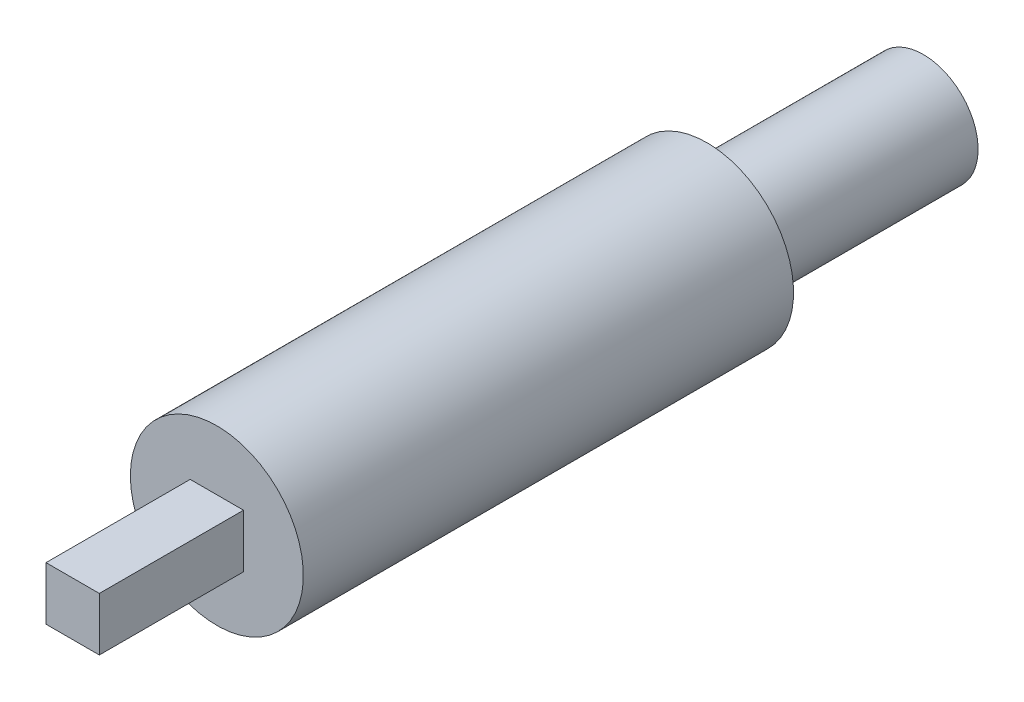
ISO-10303-21;
HEADER;
FILE_DESCRIPTION(('STEP AP214'),'2;1');
FILE_NAME('part.step','',(''),(''),'','','');
FILE_SCHEMA(('AUTOMOTIVE_DESIGN { 1 0 10303 214 1 1 1 1 }'));
ENDSEC;
DATA;
#1=APPLICATION_CONTEXT('core data for automotive mechanical design processes');
#2=APPLICATION_PROTOCOL_DEFINITION('international standard','automotive_design',2000,#1);
#3=PRODUCT_CONTEXT('',#1,'mechanical');
#4=PRODUCT('Part','Part','',(#3));
#5=PRODUCT_RELATED_PRODUCT_CATEGORY('part','',(#4));
#6=PRODUCT_DEFINITION_FORMATION('','',#4);
#7=PRODUCT_DEFINITION_CONTEXT('part definition',#1,'design');
#8=PRODUCT_DEFINITION('design','',#6,#7);
#9=PRODUCT_DEFINITION_SHAPE('','',#8);
#10=(LENGTH_UNIT() NAMED_UNIT(*) SI_UNIT(.MILLI.,.METRE.));
#11=(NAMED_UNIT(*) PLANE_ANGLE_UNIT() SI_UNIT($,.RADIAN.));
#12=(NAMED_UNIT(*) SI_UNIT($,.STERADIAN.) SOLID_ANGLE_UNIT());
#13=UNCERTAINTY_MEASURE_WITH_UNIT(LENGTH_MEASURE(1.E-05),#10,'distance_accuracy_value','');
#14=(GEOMETRIC_REPRESENTATION_CONTEXT(3) GLOBAL_UNCERTAINTY_ASSIGNED_CONTEXT((#13)) GLOBAL_UNIT_ASSIGNED_CONTEXT((#10,
#11,#12)) REPRESENTATION_CONTEXT('',''));
#15=CARTESIAN_POINT('',(0.,0.,0.));
#16=DIRECTION('',(0.,0.,1.));
#17=DIRECTION('',(1.,0.,0.));
#18=AXIS2_PLACEMENT_3D('',#15,#16,#17);
#19=CARTESIAN_POINT('',(1.85,1.85,10.));
#20=DIRECTION('',(-1.,0.,0.));
#21=DIRECTION('',(0.,0.,1.));
#22=AXIS2_PLACEMENT_3D('',#19,#20,#21);
#23=PLANE('',#22);
#24=DIRECTION('',(0.,1.,0.));
#25=VECTOR('',#24,1.);
#26=CARTESIAN_POINT('',(1.85,1.85,0.));
#27=LINE('',#26,#25);
#28=CARTESIAN_POINT('',(1.85,-1.85,0.));
#29=VERTEX_POINT('',#28);
#30=CARTESIAN_POINT('',(1.85,1.85,0.));
#31=VERTEX_POINT('',#30);
#32=EDGE_CURVE('E79',#29,#31,#27,.T.);
#33=ORIENTED_EDGE('',*,*,#32,.T.);
#34=DIRECTION('',(0.,0.,-1.));
#35=VECTOR('',#34,1.);
#36=CARTESIAN_POINT('',(1.85,1.85,10.));
#37=LINE('',#36,#35);
#38=CARTESIAN_POINT('',(1.85,1.85,10.));
#39=VERTEX_POINT('',#38);
#40=EDGE_CURVE('E11',#39,#31,#37,.T.);
#41=ORIENTED_EDGE('',*,*,#40,.F.);
#42=DIRECTION('',(0.,1.,0.));
#43=VECTOR('',#42,1.);
#44=CARTESIAN_POINT('',(1.85,1.85,10.));
#45=LINE('',#44,#43);
#46=CARTESIAN_POINT('',(1.85,-1.85,10.));
#47=VERTEX_POINT('',#46);
#48=EDGE_CURVE('E83',#47,#39,#45,.T.);
#49=ORIENTED_EDGE('',*,*,#48,.F.);
#50=DIRECTION('',(0.,0.,-1.));
#51=VECTOR('',#50,1.);
#52=CARTESIAN_POINT('',(1.85,-1.85,10.));
#53=LINE('',#52,#51);
#54=EDGE_CURVE('E95',#47,#29,#53,.T.);
#55=ORIENTED_EDGE('',*,*,#54,.T.);
#56=EDGE_LOOP('',(#33,#41,#49,#55));
#57=FACE_BOUND('',#56,.T.);
#58=ADVANCED_FACE('F37',(#57),#23,.F.);
#59=CARTESIAN_POINT('',(-1.85,1.85,10.));
#60=DIRECTION('',(0.,-1.,0.));
#61=DIRECTION('',(1.,0.,0.));
#62=AXIS2_PLACEMENT_3D('',#59,#60,#61);
#63=PLANE('',#62);
#64=DIRECTION('',(-1.,0.,0.));
#65=VECTOR('',#64,1.);
#66=CARTESIAN_POINT('',(-1.85,1.85,0.));
#67=LINE('',#66,#65);
#68=CARTESIAN_POINT('',(-1.85,1.85,0.));
#69=VERTEX_POINT('',#68);
#70=EDGE_CURVE('E92',#31,#69,#67,.T.);
#71=ORIENTED_EDGE('',*,*,#70,.T.);
#72=DIRECTION('',(0.,0.,-1.));
#73=VECTOR('',#72,1.);
#74=CARTESIAN_POINT('',(-1.85,1.85,10.));
#75=LINE('',#74,#73);
#76=CARTESIAN_POINT('',(-1.85,1.85,10.));
#77=VERTEX_POINT('',#76);
#78=EDGE_CURVE('E45',#77,#69,#75,.T.);
#79=ORIENTED_EDGE('',*,*,#78,.F.);
#80=DIRECTION('',(-1.,0.,0.));
#81=VECTOR('',#80,1.);
#82=CARTESIAN_POINT('',(-1.85,1.85,10.));
#83=LINE('',#82,#81);
#84=EDGE_CURVE('E105',#39,#77,#83,.T.);
#85=ORIENTED_EDGE('',*,*,#84,.F.);
#86=ORIENTED_EDGE('',*,*,#40,.T.);
#87=EDGE_LOOP('',(#71,#79,#85,#86));
#88=FACE_BOUND('',#87,.T.);
#89=ADVANCED_FACE('F148',(#88),#63,.F.);
#90=CARTESIAN_POINT('',(-1.85,1.85,10.));
#91=DIRECTION('',(1.,0.,0.));
#92=DIRECTION('',(0.,1.,0.));
#93=AXIS2_PLACEMENT_3D('',#90,#91,#92);
#94=PLANE('',#93);
#95=DIRECTION('',(0.,-1.,0.));
#96=VECTOR('',#95,1.);
#97=CARTESIAN_POINT('',(-1.85,1.85,0.));
#98=LINE('',#97,#96);
#99=CARTESIAN_POINT('',(-1.85,-1.85,0.));
#100=VERTEX_POINT('',#99);
#101=EDGE_CURVE('E76',#69,#100,#98,.T.);
#102=ORIENTED_EDGE('',*,*,#101,.T.);
#103=DIRECTION('',(0.,0.,-1.));
#104=VECTOR('',#103,1.);
#105=CARTESIAN_POINT('',(-1.85,-1.85,10.));
#106=LINE('',#105,#104);
#107=CARTESIAN_POINT('',(-1.85,-1.85,10.));
#108=VERTEX_POINT('',#107);
#109=EDGE_CURVE('E90',#108,#100,#106,.T.);
#110=ORIENTED_EDGE('',*,*,#109,.F.);
#111=DIRECTION('',(0.,-1.,0.));
#112=VECTOR('',#111,1.);
#113=CARTESIAN_POINT('',(-1.85,1.85,10.));
#114=LINE('',#113,#112);
#115=EDGE_CURVE('E103',#77,#108,#114,.T.);
#116=ORIENTED_EDGE('',*,*,#115,.F.);
#117=ORIENTED_EDGE('',*,*,#78,.T.);
#118=EDGE_LOOP('',(#102,#110,#116,#117));
#119=FACE_BOUND('',#118,.T.);
#120=ADVANCED_FACE('F88',(#119),#94,.F.);
#121=CARTESIAN_POINT('',(-1.85,-1.85,10.));
#122=DIRECTION('',(0.,1.,0.));
#123=DIRECTION('',(0.,0.,1.));
#124=AXIS2_PLACEMENT_3D('',#121,#122,#123);
#125=PLANE('',#124);
#126=DIRECTION('',(1.,0.,0.));
#127=VECTOR('',#126,1.);
#128=CARTESIAN_POINT('',(-1.85,-1.85,0.));
#129=LINE('',#128,#127);
#130=EDGE_CURVE('E73',#100,#29,#129,.T.);
#131=ORIENTED_EDGE('',*,*,#130,.T.);
#132=ORIENTED_EDGE('',*,*,#54,.F.);
#133=DIRECTION('',(1.,0.,0.));
#134=VECTOR('',#133,1.);
#135=CARTESIAN_POINT('',(-1.85,-1.85,10.));
#136=LINE('',#135,#134);
#137=EDGE_CURVE('E52',#108,#47,#136,.T.);
#138=ORIENTED_EDGE('',*,*,#137,.F.);
#139=ORIENTED_EDGE('',*,*,#109,.T.);
#140=EDGE_LOOP('',(#131,#132,#138,#139));
#141=FACE_BOUND('',#140,.T.);
#142=ADVANCED_FACE('F94',(#141),#125,.F.);
#143=CARTESIAN_POINT('',(0.,0.,10.));
#144=DIRECTION('',(0.,0.,1.));
#145=DIRECTION('',(1.,0.,0.));
#146=AXIS2_PLACEMENT_3D('',#143,#144,#145);
#147=PLANE('',#146);
#148=ORIENTED_EDGE('',*,*,#48,.T.);
#149=ORIENTED_EDGE('',*,*,#84,.T.);
#150=ORIENTED_EDGE('',*,*,#115,.T.);
#151=ORIENTED_EDGE('',*,*,#137,.T.);
#152=EDGE_LOOP('',(#148,#149,#150,#151));
#153=FACE_BOUND('',#152,.T.);
#154=ADVANCED_FACE('F141',(#153),#147,.T.);
#155=CARTESIAN_POINT('',(0.,0.,0.));
#156=DIRECTION('',(0.,0.,-1.));
#157=DIRECTION('',(-1.,0.,0.));
#158=AXIS2_PLACEMENT_3D('',#155,#156,#157);
#159=PLANE('',#158);
#160=CARTESIAN_POINT('',(0.,0.,0.));
#161=DIRECTION('',(0.,0.,-1.));
#162=DIRECTION('',(-1.,0.,0.));
#163=AXIS2_PLACEMENT_3D('',#160,#161,#162);
#164=CIRCLE('',#163,6.);
#165=CARTESIAN_POINT('',(-6.,0.,0.));
#166=VERTEX_POINT('',#165);
#167=EDGE_CURVE('E108',#166,#166,#164,.T.);
#168=ORIENTED_EDGE('',*,*,#167,.F.);
#169=EDGE_LOOP('',(#168));
#170=FACE_BOUND('',#169,.T.);
#171=ORIENTED_EDGE('',*,*,#70,.F.);
#172=ORIENTED_EDGE('',*,*,#32,.F.);
#173=ORIENTED_EDGE('',*,*,#130,.F.);
#174=ORIENTED_EDGE('',*,*,#101,.F.);
#175=EDGE_LOOP('',(#171,#172,#173,#174));
#176=FACE_BOUND('',#175,.T.);
#177=ADVANCED_FACE('F75',(#170,#176),#159,.F.);
#178=CARTESIAN_POINT('',(0.,0.,-34.));
#179=DIRECTION('',(0.,0.,1.));
#180=DIRECTION('',(1.,0.,0.));
#181=AXIS2_PLACEMENT_3D('',#178,#179,#180);
#182=CYLINDRICAL_SURFACE('',#181,6.);
#183=CARTESIAN_POINT('',(0.,0.,-34.));
#184=DIRECTION('',(0.,0.,-1.));
#185=DIRECTION('',(-1.,0.,0.));
#186=AXIS2_PLACEMENT_3D('',#183,#184,#185);
#187=CIRCLE('',#186,6.);
#188=CARTESIAN_POINT('',(-6.,0.,-34.));
#189=VERTEX_POINT('',#188);
#190=EDGE_CURVE('E101',#189,#189,#187,.T.);
#191=ORIENTED_EDGE('',*,*,#190,.F.);
#192=EDGE_LOOP('',(#191));
#193=FACE_BOUND('',#192,.T.);
#194=ORIENTED_EDGE('',*,*,#167,.T.);
#195=EDGE_LOOP('',(#194));
#196=FACE_BOUND('',#195,.T.);
#197=ADVANCED_FACE('F131',(#193,#196),#182,.T.);
#198=CARTESIAN_POINT('',(0.,0.,-34.));
#199=DIRECTION('',(0.,0.,-1.));
#200=DIRECTION('',(-1.,0.,0.));
#201=AXIS2_PLACEMENT_3D('',#198,#199,#200);
#202=PLANE('',#201);
#203=CARTESIAN_POINT('',(0.,0.,-34.));
#204=DIRECTION('',(0.,0.,-1.));
#205=DIRECTION('',(-1.,0.,0.));
#206=AXIS2_PLACEMENT_3D('',#203,#204,#205);
#207=CIRCLE('',#206,3.8);
#208=CARTESIAN_POINT('',(-3.8,0.,-34.));
#209=VERTEX_POINT('',#208);
#210=EDGE_CURVE('E114',#209,#209,#207,.T.);
#211=ORIENTED_EDGE('',*,*,#210,.F.);
#212=EDGE_LOOP('',(#211));
#213=FACE_BOUND('',#212,.T.);
#214=ORIENTED_EDGE('',*,*,#190,.T.);
#215=EDGE_LOOP('',(#214));
#216=FACE_BOUND('',#215,.T.);
#217=ADVANCED_FACE('F125',(#213,#216),#202,.T.);
#218=CARTESIAN_POINT('',(0.,0.,-49.));
#219=DIRECTION('',(0.,0.,1.));
#220=DIRECTION('',(1.,0.,0.));
#221=AXIS2_PLACEMENT_3D('',#218,#219,#220);
#222=CYLINDRICAL_SURFACE('',#221,3.8);
#223=CARTESIAN_POINT('',(0.,0.,-49.));
#224=DIRECTION('',(0.,0.,-1.));
#225=DIRECTION('',(-1.,0.,0.));
#226=AXIS2_PLACEMENT_3D('',#223,#224,#225);
#227=CIRCLE('',#226,3.8);
#228=CARTESIAN_POINT('',(-3.8,0.,-49.));
#229=VERTEX_POINT('',#228);
#230=EDGE_CURVE('E111',#229,#229,#227,.T.);
#231=ORIENTED_EDGE('',*,*,#230,.F.);
#232=EDGE_LOOP('',(#231));
#233=FACE_BOUND('',#232,.T.);
#234=ORIENTED_EDGE('',*,*,#210,.T.);
#235=EDGE_LOOP('',(#234));
#236=FACE_BOUND('',#235,.T.);
#237=ADVANCED_FACE('F122',(#233,#236),#222,.T.);
#238=CARTESIAN_POINT('',(0.,0.,-49.));
#239=DIRECTION('',(0.,0.,-1.));
#240=DIRECTION('',(-1.,0.,0.));
#241=AXIS2_PLACEMENT_3D('',#238,#239,#240);
#242=PLANE('',#241);
#243=ORIENTED_EDGE('',*,*,#230,.T.);
#244=EDGE_LOOP('',(#243));
#245=FACE_BOUND('',#244,.T.);
#246=ADVANCED_FACE('F120',(#245),#242,.T.);
#247=CLOSED_SHELL('',(#58,#89,#120,#142,#154,#177,#197,#217,#237,#246));
#248=MANIFOLD_SOLID_BREP('B2',#247);
#249=ADVANCED_BREP_SHAPE_REPRESENTATION('',(#18,#248),#14);
#250=SHAPE_DEFINITION_REPRESENTATION(#9,#249);
ENDSEC;
END-ISO-10303-21;
